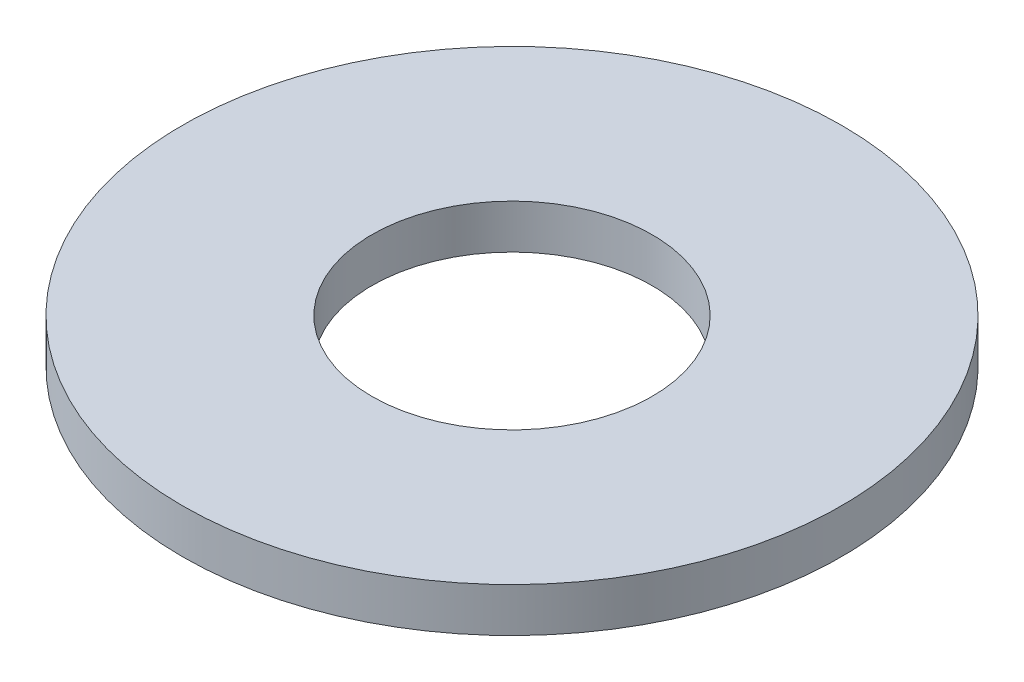
ISO-10303-21;
HEADER;
FILE_DESCRIPTION(('STEP AP214'),'2;1');
FILE_NAME('part.step','',(''),(''),'','','');
FILE_SCHEMA(('AUTOMOTIVE_DESIGN { 1 0 10303 214 1 1 1 1 }'));
ENDSEC;
DATA;
#1=APPLICATION_CONTEXT('core data for automotive mechanical design processes');
#2=APPLICATION_PROTOCOL_DEFINITION('international standard','automotive_design',2000,#1);
#3=PRODUCT_CONTEXT('',#1,'mechanical');
#4=PRODUCT('Part','Part','',(#3));
#5=PRODUCT_RELATED_PRODUCT_CATEGORY('part','',(#4));
#6=PRODUCT_DEFINITION_FORMATION('','',#4);
#7=PRODUCT_DEFINITION_CONTEXT('part definition',#1,'design');
#8=PRODUCT_DEFINITION('design','',#6,#7);
#9=PRODUCT_DEFINITION_SHAPE('','',#8);
#10=(LENGTH_UNIT() NAMED_UNIT(*) SI_UNIT(.MILLI.,.METRE.));
#11=(NAMED_UNIT(*) PLANE_ANGLE_UNIT() SI_UNIT($,.RADIAN.));
#12=(NAMED_UNIT(*) SI_UNIT($,.STERADIAN.) SOLID_ANGLE_UNIT());
#13=UNCERTAINTY_MEASURE_WITH_UNIT(LENGTH_MEASURE(1.E-05),#10,'distance_accuracy_value','');
#14=(GEOMETRIC_REPRESENTATION_CONTEXT(3) GLOBAL_UNCERTAINTY_ASSIGNED_CONTEXT((#13)) GLOBAL_UNIT_ASSIGNED_CONTEXT((#10,
#11,#12)) REPRESENTATION_CONTEXT('',''));
#15=CARTESIAN_POINT('',(0.,0.,0.));
#16=DIRECTION('',(0.,0.,1.));
#17=DIRECTION('',(1.,0.,0.));
#18=AXIS2_PLACEMENT_3D('',#15,#16,#17);
#19=CARTESIAN_POINT('',(0.,0.26,0.));
#20=DIRECTION('',(0.,1.,0.));
#21=DIRECTION('',(0.,0.,1.));
#22=AXIS2_PLACEMENT_3D('',#19,#20,#21);
#23=PLANE('',#22);
#24=CARTESIAN_POINT('',(0.,0.26,0.));
#25=DIRECTION('',(0.,1.,0.));
#26=DIRECTION('',(0.,0.,1.));
#27=AXIS2_PLACEMENT_3D('',#24,#25,#26);
#28=CIRCLE('',#27,1.94);
#29=CARTESIAN_POINT('',(0.,0.26,1.94));
#30=VERTEX_POINT('',#29);
#31=EDGE_CURVE('E10',#30,#30,#28,.T.);
#32=ORIENTED_EDGE('',*,*,#31,.T.);
#33=EDGE_LOOP('',(#32));
#34=FACE_BOUND('',#33,.T.);
#35=CARTESIAN_POINT('',(0.,0.26,0.));
#36=DIRECTION('',(0.,1.,0.));
#37=DIRECTION('',(0.,0.,1.));
#38=AXIS2_PLACEMENT_3D('',#35,#36,#37);
#39=CIRCLE('',#38,0.825);
#40=CARTESIAN_POINT('',(0.,0.26,0.825));
#41=VERTEX_POINT('',#40);
#42=EDGE_CURVE('E50',#41,#41,#39,.T.);
#43=ORIENTED_EDGE('',*,*,#42,.F.);
#44=EDGE_LOOP('',(#43));
#45=FACE_BOUND('',#44,.T.);
#46=ADVANCED_FACE('F37',(#34,#45),#23,.T.);
#47=CARTESIAN_POINT('',(0.,0.,0.));
#48=DIRECTION('',(0.,1.,0.));
#49=DIRECTION('',(0.,0.,1.));
#50=AXIS2_PLACEMENT_3D('',#47,#48,#49);
#51=PLANE('',#50);
#52=CARTESIAN_POINT('',(0.,0.,0.));
#53=DIRECTION('',(0.,1.,0.));
#54=DIRECTION('',(0.,0.,1.));
#55=AXIS2_PLACEMENT_3D('',#52,#53,#54);
#56=CIRCLE('',#55,1.94);
#57=CARTESIAN_POINT('',(0.,0.,1.94));
#58=VERTEX_POINT('',#57);
#59=EDGE_CURVE('E41',#58,#58,#56,.T.);
#60=ORIENTED_EDGE('',*,*,#59,.F.);
#61=EDGE_LOOP('',(#60));
#62=FACE_BOUND('',#61,.T.);
#63=CARTESIAN_POINT('',(0.,0.,0.));
#64=DIRECTION('',(0.,1.,0.));
#65=DIRECTION('',(0.,0.,1.));
#66=AXIS2_PLACEMENT_3D('',#63,#64,#65);
#67=CIRCLE('',#66,0.825);
#68=CARTESIAN_POINT('',(0.,0.,0.825));
#69=VERTEX_POINT('',#68);
#70=EDGE_CURVE('E52',#69,#69,#67,.T.);
#71=ORIENTED_EDGE('',*,*,#70,.T.);
#72=EDGE_LOOP('',(#71));
#73=FACE_BOUND('',#72,.T.);
#74=ADVANCED_FACE('F64',(#62,#73),#51,.F.);
#75=CARTESIAN_POINT('',(0.,0.26,0.));
#76=DIRECTION('',(0.,-1.,0.));
#77=DIRECTION('',(0.,0.,-1.));
#78=AXIS2_PLACEMENT_3D('',#75,#76,#77);
#79=CYLINDRICAL_SURFACE('',#78,1.94);
#80=ORIENTED_EDGE('',*,*,#31,.F.);
#81=EDGE_LOOP('',(#80));
#82=FACE_BOUND('',#81,.T.);
#83=ORIENTED_EDGE('',*,*,#59,.T.);
#84=EDGE_LOOP('',(#83));
#85=FACE_BOUND('',#84,.T.);
#86=ADVANCED_FACE('F39',(#82,#85),#79,.T.);
#87=CARTESIAN_POINT('',(0.,0.26,0.));
#88=DIRECTION('',(0.,-1.,0.));
#89=DIRECTION('',(0.,0.,-1.));
#90=AXIS2_PLACEMENT_3D('',#87,#88,#89);
#91=CYLINDRICAL_SURFACE('',#90,0.825);
#92=ORIENTED_EDGE('',*,*,#42,.T.);
#93=EDGE_LOOP('',(#92));
#94=FACE_BOUND('',#93,.T.);
#95=ORIENTED_EDGE('',*,*,#70,.F.);
#96=EDGE_LOOP('',(#95));
#97=FACE_BOUND('',#96,.T.);
#98=ADVANCED_FACE('F60',(#94,#97),#91,.F.);
#99=CLOSED_SHELL('',(#46,#74,#86,#98));
#100=MANIFOLD_SOLID_BREP('B2',#99);
#101=ADVANCED_BREP_SHAPE_REPRESENTATION('',(#18,#100),#14);
#102=SHAPE_DEFINITION_REPRESENTATION(#9,#101);
ENDSEC;
END-ISO-10303-21;
